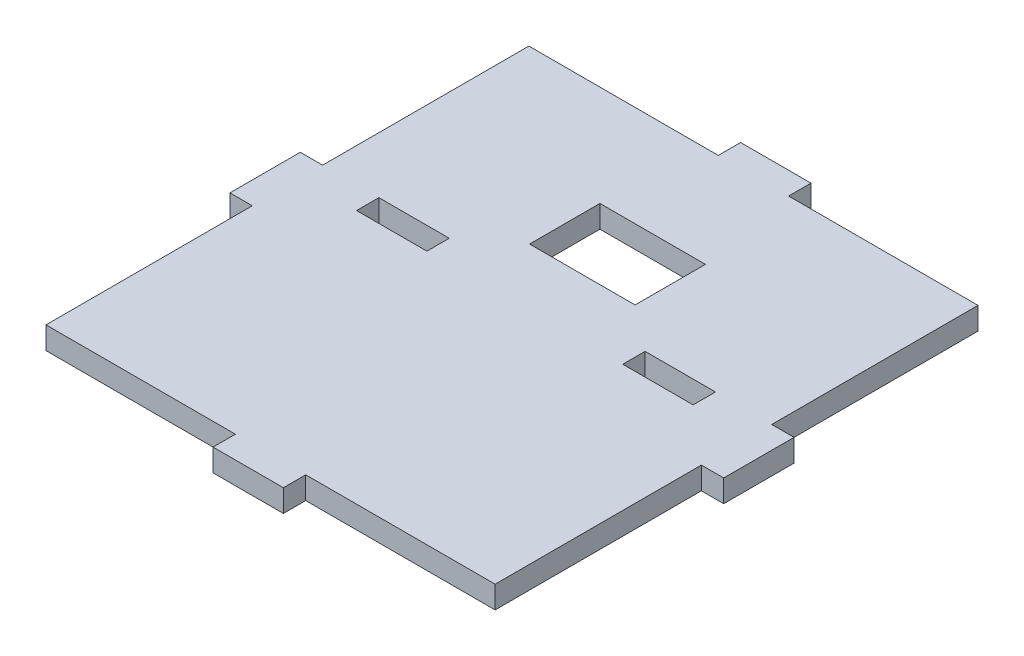
ISO-10303-21;
HEADER;
FILE_DESCRIPTION(('STEP AP214'),'2;1');
FILE_NAME('part.step','',(''),(''),'','','');
FILE_SCHEMA(('AUTOMOTIVE_DESIGN { 1 0 10303 214 1 1 1 1 }'));
ENDSEC;
DATA;
#1=APPLICATION_CONTEXT('core data for automotive mechanical design processes');
#2=APPLICATION_PROTOCOL_DEFINITION('international standard','automotive_design',2000,#1);
#3=PRODUCT_CONTEXT('',#1,'mechanical');
#4=PRODUCT('Part','Part','',(#3));
#5=PRODUCT_RELATED_PRODUCT_CATEGORY('part','',(#4));
#6=PRODUCT_DEFINITION_FORMATION('','',#4);
#7=PRODUCT_DEFINITION_CONTEXT('part definition',#1,'design');
#8=PRODUCT_DEFINITION('design','',#6,#7);
#9=PRODUCT_DEFINITION_SHAPE('','',#8);
#10=(LENGTH_UNIT() NAMED_UNIT(*) SI_UNIT(.MILLI.,.METRE.));
#11=(NAMED_UNIT(*) PLANE_ANGLE_UNIT() SI_UNIT($,.RADIAN.));
#12=(NAMED_UNIT(*) SI_UNIT($,.STERADIAN.) SOLID_ANGLE_UNIT());
#13=UNCERTAINTY_MEASURE_WITH_UNIT(LENGTH_MEASURE(1.E-05),#10,'distance_accuracy_value','');
#14=(GEOMETRIC_REPRESENTATION_CONTEXT(3) GLOBAL_UNCERTAINTY_ASSIGNED_CONTEXT((#13)) GLOBAL_UNIT_ASSIGNED_CONTEXT((#10,
#11,#12)) REPRESENTATION_CONTEXT('',''));
#15=CARTESIAN_POINT('',(0.,0.,0.));
#16=DIRECTION('',(0.,0.,1.));
#17=DIRECTION('',(1.,0.,0.));
#18=AXIS2_PLACEMENT_3D('',#15,#16,#17);
#19=CARTESIAN_POINT('',(140.4,12.7,0.));
#20=DIRECTION('',(1.,0.,0.));
#21=DIRECTION('',(0.,0.,-1.));
#22=AXIS2_PLACEMENT_3D('',#19,#20,#21);
#23=PLANE('',#22);
#24=DIRECTION('',(0.,0.,1.));
#25=VECTOR('',#24,1.);
#26=CARTESIAN_POINT('',(140.4,0.,0.));
#27=LINE('',#26,#25);
#28=CARTESIAN_POINT('',(140.4,0.,-20.));
#29=VERTEX_POINT('',#28);
#30=CARTESIAN_POINT('',(140.4,0.,20.));
#31=VERTEX_POINT('',#30);
#32=EDGE_CURVE('E387',#29,#31,#27,.T.);
#33=ORIENTED_EDGE('',*,*,#32,.F.);
#34=DIRECTION('',(0.,-1.,0.));
#35=VECTOR('',#34,1.);
#36=CARTESIAN_POINT('',(140.4,12.7,-20.));
#37=LINE('',#36,#35);
#38=CARTESIAN_POINT('',(140.4,12.7,-20.));
#39=VERTEX_POINT('',#38);
#40=EDGE_CURVE('E12',#39,#29,#37,.T.);
#41=ORIENTED_EDGE('',*,*,#40,.F.);
#42=DIRECTION('',(0.,0.,1.));
#43=VECTOR('',#42,1.);
#44=CARTESIAN_POINT('',(140.4,12.7,0.));
#45=LINE('',#44,#43);
#46=CARTESIAN_POINT('',(140.4,12.7,20.));
#47=VERTEX_POINT('',#46);
#48=EDGE_CURVE('E377',#39,#47,#45,.T.);
#49=ORIENTED_EDGE('',*,*,#48,.T.);
#50=DIRECTION('',(0.,-1.,0.));
#51=VECTOR('',#50,1.);
#52=CARTESIAN_POINT('',(140.4,12.7,20.));
#53=LINE('',#52,#51);
#54=EDGE_CURVE('E386',#47,#31,#53,.T.);
#55=ORIENTED_EDGE('',*,*,#54,.T.);
#56=EDGE_LOOP('',(#33,#41,#49,#55));
#57=FACE_BOUND('',#56,.T.);
#58=ADVANCED_FACE('F65',(#57),#23,.T.);
#59=CARTESIAN_POINT('',(0.,12.7,-20.));
#60=DIRECTION('',(0.,0.,-1.));
#61=DIRECTION('',(-1.,0.,0.));
#62=AXIS2_PLACEMENT_3D('',#59,#60,#61);
#63=PLANE('',#62);
#64=DIRECTION('',(1.,0.,0.));
#65=VECTOR('',#64,1.);
#66=CARTESIAN_POINT('',(0.,0.,-20.));
#67=LINE('',#66,#65);
#68=CARTESIAN_POINT('',(127.7,0.,-20.));
#69=VERTEX_POINT('',#68);
#70=EDGE_CURVE('E390',#69,#29,#67,.T.);
#71=ORIENTED_EDGE('',*,*,#70,.F.);
#72=DIRECTION('',(0.,-1.,0.));
#73=VECTOR('',#72,1.);
#74=CARTESIAN_POINT('',(127.7,12.7,-20.));
#75=LINE('',#74,#73);
#76=CARTESIAN_POINT('',(127.7,12.7,-20.));
#77=VERTEX_POINT('',#76);
#78=EDGE_CURVE('E74',#77,#69,#75,.T.);
#79=ORIENTED_EDGE('',*,*,#78,.F.);
#80=DIRECTION('',(1.,0.,0.));
#81=VECTOR('',#80,1.);
#82=CARTESIAN_POINT('',(0.,12.7,-20.));
#83=LINE('',#82,#81);
#84=EDGE_CURVE('E380',#77,#39,#83,.T.);
#85=ORIENTED_EDGE('',*,*,#84,.T.);
#86=ORIENTED_EDGE('',*,*,#40,.T.);
#87=EDGE_LOOP('',(#71,#79,#85,#86));
#88=FACE_BOUND('',#87,.T.);
#89=ADVANCED_FACE('F550',(#88),#63,.T.);
#90=CARTESIAN_POINT('',(0.,12.7,20.));
#91=DIRECTION('',(0.,0.,-1.));
#92=DIRECTION('',(-1.,0.,0.));
#93=AXIS2_PLACEMENT_3D('',#90,#91,#92);
#94=PLANE('',#93);
#95=DIRECTION('',(1.,0.,0.));
#96=VECTOR('',#95,1.);
#97=CARTESIAN_POINT('',(0.,0.,20.));
#98=LINE('',#97,#96);
#99=CARTESIAN_POINT('',(127.7,0.,20.));
#100=VERTEX_POINT('',#99);
#101=EDGE_CURVE('E381',#100,#31,#98,.T.);
#102=ORIENTED_EDGE('',*,*,#101,.T.);
#103=ORIENTED_EDGE('',*,*,#54,.F.);
#104=DIRECTION('',(1.,0.,0.));
#105=VECTOR('',#104,1.);
#106=CARTESIAN_POINT('',(0.,12.7,20.));
#107=LINE('',#106,#105);
#108=CARTESIAN_POINT('',(127.7,12.7,20.));
#109=VERTEX_POINT('',#108);
#110=EDGE_CURVE('E384',#109,#47,#107,.T.);
#111=ORIENTED_EDGE('',*,*,#110,.F.);
#112=DIRECTION('',(0.,-1.,0.));
#113=VECTOR('',#112,1.);
#114=CARTESIAN_POINT('',(127.7,12.7,20.));
#115=LINE('',#114,#113);
#116=EDGE_CURVE('E397',#109,#100,#115,.T.);
#117=ORIENTED_EDGE('',*,*,#116,.T.);
#118=EDGE_LOOP('',(#102,#103,#111,#117));
#119=FACE_BOUND('',#118,.T.);
#120=ADVANCED_FACE('F558',(#119),#94,.F.);
#121=CARTESIAN_POINT('',(0.,12.7,0.));
#122=DIRECTION('',(0.,1.,0.));
#123=DIRECTION('',(0.,0.,1.));
#124=AXIS2_PLACEMENT_3D('',#121,#122,#123);
#125=PLANE('',#124);
#126=DIRECTION('',(0.,0.,1.));
#127=VECTOR('',#126,1.);
#128=CARTESIAN_POINT('',(-95.7,12.7,-20.));
#129=LINE('',#128,#127);
#130=CARTESIAN_POINT('',(-95.7,12.7,-20.));
#131=VERTEX_POINT('',#130);
#132=CARTESIAN_POINT('',(-95.7,12.7,-7.29999999999999));
#133=VERTEX_POINT('',#132);
#134=EDGE_CURVE('E82',#131,#133,#129,.T.);
#135=ORIENTED_EDGE('',*,*,#134,.F.);
#136=DIRECTION('',(-1.,0.,0.));
#137=VECTOR('',#136,1.);
#138=CARTESIAN_POINT('',(-95.7,12.7,-20.));
#139=LINE('',#138,#137);
#140=CARTESIAN_POINT('',(-55.7,12.7,-20.));
#141=VERTEX_POINT('',#140);
#142=EDGE_CURVE('E296',#141,#131,#139,.T.);
#143=ORIENTED_EDGE('',*,*,#142,.F.);
#144=DIRECTION('',(0.,0.,-1.));
#145=VECTOR('',#144,1.);
#146=CARTESIAN_POINT('',(-55.7,12.7,-20.));
#147=LINE('',#146,#145);
#148=CARTESIAN_POINT('',(-55.7,12.7,-7.29999999999999));
#149=VERTEX_POINT('',#148);
#150=EDGE_CURVE('E299',#149,#141,#147,.T.);
#151=ORIENTED_EDGE('',*,*,#150,.F.);
#152=DIRECTION('',(1.,0.,0.));
#153=VECTOR('',#152,1.);
#154=CARTESIAN_POINT('',(-95.7,12.7,-7.29999999999999));
#155=LINE('',#154,#153);
#156=EDGE_CURVE('E305',#133,#149,#155,.T.);
#157=ORIENTED_EDGE('',*,*,#156,.F.);
#158=EDGE_LOOP('',(#135,#143,#151,#157));
#159=FACE_BOUND('',#158,.T.);
#160=DIRECTION('',(0.,0.,1.));
#161=VECTOR('',#160,1.);
#162=CARTESIAN_POINT('',(55.7,12.7,-20.));
#163=LINE('',#162,#161);
#164=CARTESIAN_POINT('',(55.7,12.7,-20.));
#165=VERTEX_POINT('',#164);
#166=CARTESIAN_POINT('',(55.7,12.7,-7.29999999999999));
#167=VERTEX_POINT('',#166);
#168=EDGE_CURVE('E90',#165,#167,#163,.T.);
#169=ORIENTED_EDGE('',*,*,#168,.F.);
#170=DIRECTION('',(-1.,0.,0.));
#171=VECTOR('',#170,1.);
#172=CARTESIAN_POINT('',(55.7,12.7,-20.));
#173=LINE('',#172,#171);
#174=CARTESIAN_POINT('',(95.7,12.7,-20.));
#175=VERTEX_POINT('',#174);
#176=EDGE_CURVE('E325',#175,#165,#173,.T.);
#177=ORIENTED_EDGE('',*,*,#176,.F.);
#178=DIRECTION('',(0.,0.,-1.));
#179=VECTOR('',#178,1.);
#180=CARTESIAN_POINT('',(95.7,12.7,-20.));
#181=LINE('',#180,#179);
#182=CARTESIAN_POINT('',(95.7,12.7,-7.29999999999999));
#183=VERTEX_POINT('',#182);
#184=EDGE_CURVE('E328',#183,#175,#181,.T.);
#185=ORIENTED_EDGE('',*,*,#184,.F.);
#186=DIRECTION('',(1.,0.,0.));
#187=VECTOR('',#186,1.);
#188=CARTESIAN_POINT('',(55.7,12.7,-7.29999999999999));
#189=LINE('',#188,#187);
#190=EDGE_CURVE('E332',#167,#183,#189,.T.);
#191=ORIENTED_EDGE('',*,*,#190,.F.);
#192=EDGE_LOOP('',(#169,#177,#185,#191));
#193=FACE_BOUND('',#192,.T.);
#194=DIRECTION('',(0.,0.,1.));
#195=VECTOR('',#194,1.);
#196=CARTESIAN_POINT('',(-30.,12.7,-40.));
#197=LINE('',#196,#195);
#198=CARTESIAN_POINT('',(-30.,12.7,-80.));
#199=VERTEX_POINT('',#198);
#200=CARTESIAN_POINT('',(-30.,12.7,-40.));
#201=VERTEX_POINT('',#200);
#202=EDGE_CURVE('E324',#199,#201,#197,.T.);
#203=ORIENTED_EDGE('',*,*,#202,.F.);
#204=DIRECTION('',(-1.,0.,0.));
#205=VECTOR('',#204,1.);
#206=CARTESIAN_POINT('',(-30.,12.7,-80.));
#207=LINE('',#206,#205);
#208=CARTESIAN_POINT('',(30.,12.7,-80.));
#209=VERTEX_POINT('',#208);
#210=EDGE_CURVE('E356',#209,#199,#207,.T.);
#211=ORIENTED_EDGE('',*,*,#210,.F.);
#212=DIRECTION('',(0.,0.,-1.));
#213=VECTOR('',#212,1.);
#214=CARTESIAN_POINT('',(30.,12.7,-40.));
#215=LINE('',#214,#213);
#216=CARTESIAN_POINT('',(30.,12.7,-40.));
#217=VERTEX_POINT('',#216);
#218=EDGE_CURVE('E359',#217,#209,#215,.T.);
#219=ORIENTED_EDGE('',*,*,#218,.F.);
#220=DIRECTION('',(1.,0.,0.));
#221=VECTOR('',#220,1.);
#222=CARTESIAN_POINT('',(-30.,12.7,-40.));
#223=LINE('',#222,#221);
#224=EDGE_CURVE('E363',#201,#217,#223,.T.);
#225=ORIENTED_EDGE('',*,*,#224,.F.);
#226=EDGE_LOOP('',(#203,#211,#219,#225));
#227=FACE_BOUND('',#226,.T.);
#228=ORIENTED_EDGE('',*,*,#48,.F.);
#229=ORIENTED_EDGE('',*,*,#84,.F.);
#230=DIRECTION('',(0.,0.,-1.));
#231=VECTOR('',#230,1.);
#232=CARTESIAN_POINT('',(127.7,12.7,137.3));
#233=LINE('',#232,#231);
#234=CARTESIAN_POINT('',(127.7,12.7,-137.3));
#235=VERTEX_POINT('',#234);
#236=EDGE_CURVE('E432',#77,#235,#233,.T.);
#237=ORIENTED_EDGE('',*,*,#236,.T.);
#238=DIRECTION('',(1.,0.,0.));
#239=VECTOR('',#238,1.);
#240=CARTESIAN_POINT('',(-127.7,12.7,-137.3));
#241=LINE('',#240,#239);
#242=CARTESIAN_POINT('',(20.,12.7,-137.3));
#243=VERTEX_POINT('',#242);
#244=EDGE_CURVE('E427',#243,#235,#241,.T.);
#245=ORIENTED_EDGE('',*,*,#244,.F.);
#246=DIRECTION('',(0.,0.,-1.));
#247=VECTOR('',#246,1.);
#248=CARTESIAN_POINT('',(20.,12.7,-137.3));
#249=LINE('',#248,#247);
#250=CARTESIAN_POINT('',(20.,12.7,-150.));
#251=VERTEX_POINT('',#250);
#252=EDGE_CURVE('E502',#243,#251,#249,.T.);
#253=ORIENTED_EDGE('',*,*,#252,.T.);
#254=DIRECTION('',(1.,0.,0.));
#255=VECTOR('',#254,1.);
#256=CARTESIAN_POINT('',(-20.,12.7,-150.));
#257=LINE('',#256,#255);
#258=CARTESIAN_POINT('',(-20.,12.7,-150.));
#259=VERTEX_POINT('',#258);
#260=EDGE_CURVE('E498',#259,#251,#257,.T.);
#261=ORIENTED_EDGE('',*,*,#260,.F.);
#262=DIRECTION('',(0.,0.,-1.));
#263=VECTOR('',#262,1.);
#264=CARTESIAN_POINT('',(-20.,12.7,-137.3));
#265=LINE('',#264,#263);
#266=CARTESIAN_POINT('',(-20.,12.7,-137.3));
#267=VERTEX_POINT('',#266);
#268=EDGE_CURVE('E495',#267,#259,#265,.T.);
#269=ORIENTED_EDGE('',*,*,#268,.F.);
#270=CARTESIAN_POINT('',(-127.7,12.7,-137.3));
#271=VERTEX_POINT('',#270);
#272=EDGE_CURVE('E429',#271,#267,#241,.T.);
#273=ORIENTED_EDGE('',*,*,#272,.F.);
#274=DIRECTION('',(0.,0.,-1.));
#275=VECTOR('',#274,1.);
#276=CARTESIAN_POINT('',(-127.7,12.7,137.3));
#277=LINE('',#276,#275);
#278=CARTESIAN_POINT('',(-127.7,12.7,-20.));
#279=VERTEX_POINT('',#278);
#280=EDGE_CURVE('E428',#279,#271,#277,.T.);
#281=ORIENTED_EDGE('',*,*,#280,.F.);
#282=DIRECTION('',(-1.,0.,0.));
#283=VECTOR('',#282,1.);
#284=CARTESIAN_POINT('',(-127.7,12.7,-20.));
#285=LINE('',#284,#283);
#286=CARTESIAN_POINT('',(-140.4,12.7,-20.));
#287=VERTEX_POINT('',#286);
#288=EDGE_CURVE('E468',#279,#287,#285,.T.);
#289=ORIENTED_EDGE('',*,*,#288,.T.);
#290=DIRECTION('',(0.,0.,1.));
#291=VECTOR('',#290,1.);
#292=CARTESIAN_POINT('',(-140.4,12.7,-20.));
#293=LINE('',#292,#291);
#294=CARTESIAN_POINT('',(-140.4,12.7,20.));
#295=VERTEX_POINT('',#294);
#296=EDGE_CURVE('E471',#287,#295,#293,.T.);
#297=ORIENTED_EDGE('',*,*,#296,.T.);
#298=DIRECTION('',(-1.,0.,0.));
#299=VECTOR('',#298,1.);
#300=CARTESIAN_POINT('',(-127.7,12.7,20.));
#301=LINE('',#300,#299);
#302=CARTESIAN_POINT('',(-127.7,12.7,20.));
#303=VERTEX_POINT('',#302);
#304=EDGE_CURVE('E474',#303,#295,#301,.T.);
#305=ORIENTED_EDGE('',*,*,#304,.F.);
#306=CARTESIAN_POINT('',(-127.7,12.7,137.3));
#307=VERTEX_POINT('',#306);
#308=EDGE_CURVE('E424',#307,#303,#277,.T.);
#309=ORIENTED_EDGE('',*,*,#308,.F.);
#310=DIRECTION('',(1.,0.,0.));
#311=VECTOR('',#310,1.);
#312=CARTESIAN_POINT('',(-127.7,12.7,137.3));
#313=LINE('',#312,#311);
#314=CARTESIAN_POINT('',(-20.,12.7,137.3));
#315=VERTEX_POINT('',#314);
#316=EDGE_CURVE('E437',#307,#315,#313,.T.);
#317=ORIENTED_EDGE('',*,*,#316,.T.);
#318=DIRECTION('',(0.,0.,1.));
#319=VECTOR('',#318,1.);
#320=CARTESIAN_POINT('',(-20.,12.7,0.));
#321=LINE('',#320,#319);
#322=CARTESIAN_POINT('',(-20.,12.7,150.));
#323=VERTEX_POINT('',#322);
#324=EDGE_CURVE('E400',#315,#323,#321,.T.);
#325=ORIENTED_EDGE('',*,*,#324,.T.);
#326=DIRECTION('',(1.,0.,0.));
#327=VECTOR('',#326,1.);
#328=CARTESIAN_POINT('',(-1.04083408558608E-13,12.7,150.));
#329=LINE('',#328,#327);
#330=CARTESIAN_POINT('',(20.,12.7,150.));
#331=VERTEX_POINT('',#330);
#332=EDGE_CURVE('E402',#323,#331,#329,.T.);
#333=ORIENTED_EDGE('',*,*,#332,.T.);
#334=DIRECTION('',(0.,0.,1.));
#335=VECTOR('',#334,1.);
#336=CARTESIAN_POINT('',(20.,12.7,0.));
#337=LINE('',#336,#335);
#338=CARTESIAN_POINT('',(20.,12.7,137.3));
#339=VERTEX_POINT('',#338);
#340=EDGE_CURVE('E405',#339,#331,#337,.T.);
#341=ORIENTED_EDGE('',*,*,#340,.F.);
#342=CARTESIAN_POINT('',(127.7,12.7,137.3));
#343=VERTEX_POINT('',#342);
#344=EDGE_CURVE('E436',#339,#343,#313,.T.);
#345=ORIENTED_EDGE('',*,*,#344,.T.);
#346=EDGE_CURVE('E433',#343,#109,#233,.T.);
#347=ORIENTED_EDGE('',*,*,#346,.T.);
#348=ORIENTED_EDGE('',*,*,#110,.T.);
#349=EDGE_LOOP('',(#228,#229,#237,#245,#253,#261,#269,#273,#281,#289,#297,#305,#309,#317,#325,
#333,#341,#345,#347,#348));
#350=FACE_BOUND('',#349,.T.);
#351=ADVANCED_FACE('F531',(#159,#193,#227,#350),#125,.T.);
#352=CARTESIAN_POINT('',(0.,0.,0.));
#353=DIRECTION('',(0.,1.,0.));
#354=DIRECTION('',(0.,0.,1.));
#355=AXIS2_PLACEMENT_3D('',#352,#353,#354);
#356=PLANE('',#355);
#357=DIRECTION('',(-1.,0.,0.));
#358=VECTOR('',#357,1.);
#359=CARTESIAN_POINT('',(-95.7,0.,-20.));
#360=LINE('',#359,#358);
#361=CARTESIAN_POINT('',(-55.7,0.,-20.));
#362=VERTEX_POINT('',#361);
#363=CARTESIAN_POINT('',(-95.7,0.,-20.));
#364=VERTEX_POINT('',#363);
#365=EDGE_CURVE('E283',#362,#364,#360,.T.);
#366=ORIENTED_EDGE('',*,*,#365,.T.);
#367=DIRECTION('',(0.,0.,1.));
#368=VECTOR('',#367,1.);
#369=CARTESIAN_POINT('',(-95.7,0.,-20.));
#370=LINE('',#369,#368);
#371=CARTESIAN_POINT('',(-95.7,0.,-7.29999999999999));
#372=VERTEX_POINT('',#371);
#373=EDGE_CURVE('E277',#364,#372,#370,.T.);
#374=ORIENTED_EDGE('',*,*,#373,.T.);
#375=DIRECTION('',(1.,0.,0.));
#376=VECTOR('',#375,1.);
#377=CARTESIAN_POINT('',(-95.7,0.,-7.29999999999999));
#378=LINE('',#377,#376);
#379=CARTESIAN_POINT('',(-55.7,0.,-7.29999999999999));
#380=VERTEX_POINT('',#379);
#381=EDGE_CURVE('E287',#372,#380,#378,.T.);
#382=ORIENTED_EDGE('',*,*,#381,.T.);
#383=DIRECTION('',(0.,0.,-1.));
#384=VECTOR('',#383,1.);
#385=CARTESIAN_POINT('',(-55.7,0.,-20.));
#386=LINE('',#385,#384);
#387=EDGE_CURVE('E291',#380,#362,#386,.T.);
#388=ORIENTED_EDGE('',*,*,#387,.T.);
#389=EDGE_LOOP('',(#366,#374,#382,#388));
#390=FACE_BOUND('',#389,.T.);
#391=DIRECTION('',(-1.,0.,0.));
#392=VECTOR('',#391,1.);
#393=CARTESIAN_POINT('',(55.7,0.,-20.));
#394=LINE('',#393,#392);
#395=CARTESIAN_POINT('',(95.7,0.,-20.));
#396=VERTEX_POINT('',#395);
#397=CARTESIAN_POINT('',(55.7,0.,-20.));
#398=VERTEX_POINT('',#397);
#399=EDGE_CURVE('E317',#396,#398,#394,.T.);
#400=ORIENTED_EDGE('',*,*,#399,.T.);
#401=DIRECTION('',(0.,0.,1.));
#402=VECTOR('',#401,1.);
#403=CARTESIAN_POINT('',(55.7,0.,-20.));
#404=LINE('',#403,#402);
#405=CARTESIAN_POINT('',(55.7,0.,-7.29999999999999));
#406=VERTEX_POINT('',#405);
#407=EDGE_CURVE('E329',#398,#406,#404,.T.);
#408=ORIENTED_EDGE('',*,*,#407,.T.);
#409=DIRECTION('',(1.,0.,0.));
#410=VECTOR('',#409,1.);
#411=CARTESIAN_POINT('',(55.7,0.,-7.29999999999999));
#412=LINE('',#411,#410);
#413=CARTESIAN_POINT('',(95.7,0.,-7.29999999999999));
#414=VERTEX_POINT('',#413);
#415=EDGE_CURVE('E341',#406,#414,#412,.T.);
#416=ORIENTED_EDGE('',*,*,#415,.T.);
#417=DIRECTION('',(0.,0.,-1.));
#418=VECTOR('',#417,1.);
#419=CARTESIAN_POINT('',(95.7,0.,-20.));
#420=LINE('',#419,#418);
#421=EDGE_CURVE('E338',#414,#396,#420,.T.);
#422=ORIENTED_EDGE('',*,*,#421,.T.);
#423=EDGE_LOOP('',(#400,#408,#416,#422));
#424=FACE_BOUND('',#423,.T.);
#425=DIRECTION('',(-1.,0.,0.));
#426=VECTOR('',#425,1.);
#427=CARTESIAN_POINT('',(-30.,0.,-80.));
#428=LINE('',#427,#426);
#429=CARTESIAN_POINT('',(30.,0.,-80.));
#430=VERTEX_POINT('',#429);
#431=CARTESIAN_POINT('',(-30.,0.,-80.));
#432=VERTEX_POINT('',#431);
#433=EDGE_CURVE('E349',#430,#432,#428,.T.);
#434=ORIENTED_EDGE('',*,*,#433,.T.);
#435=DIRECTION('',(0.,0.,1.));
#436=VECTOR('',#435,1.);
#437=CARTESIAN_POINT('',(-30.,0.,-40.));
#438=LINE('',#437,#436);
#439=CARTESIAN_POINT('',(-30.,0.,-40.));
#440=VERTEX_POINT('',#439);
#441=EDGE_CURVE('E360',#432,#440,#438,.T.);
#442=ORIENTED_EDGE('',*,*,#441,.T.);
#443=DIRECTION('',(1.,0.,0.));
#444=VECTOR('',#443,1.);
#445=CARTESIAN_POINT('',(-30.,0.,-40.));
#446=LINE('',#445,#444);
#447=CARTESIAN_POINT('',(30.,0.,-40.));
#448=VERTEX_POINT('',#447);
#449=EDGE_CURVE('E372',#440,#448,#446,.T.);
#450=ORIENTED_EDGE('',*,*,#449,.T.);
#451=DIRECTION('',(0.,0.,-1.));
#452=VECTOR('',#451,1.);
#453=CARTESIAN_POINT('',(30.,0.,-40.));
#454=LINE('',#453,#452);
#455=EDGE_CURVE('E369',#448,#430,#454,.T.);
#456=ORIENTED_EDGE('',*,*,#455,.T.);
#457=EDGE_LOOP('',(#434,#442,#450,#456));
#458=FACE_BOUND('',#457,.T.);
#459=ORIENTED_EDGE('',*,*,#32,.T.);
#460=ORIENTED_EDGE('',*,*,#101,.F.);
#461=DIRECTION('',(0.,0.,-1.));
#462=VECTOR('',#461,1.);
#463=CARTESIAN_POINT('',(127.7,0.,137.3));
#464=LINE('',#463,#462);
#465=CARTESIAN_POINT('',(127.7,0.,137.3));
#466=VERTEX_POINT('',#465);
#467=EDGE_CURVE('E450',#466,#100,#464,.T.);
#468=ORIENTED_EDGE('',*,*,#467,.F.);
#469=DIRECTION('',(1.,0.,0.));
#470=VECTOR('',#469,1.);
#471=CARTESIAN_POINT('',(-127.7,0.,137.3));
#472=LINE('',#471,#470);
#473=CARTESIAN_POINT('',(20.,0.,137.3));
#474=VERTEX_POINT('',#473);
#475=EDGE_CURVE('E453',#474,#466,#472,.T.);
#476=ORIENTED_EDGE('',*,*,#475,.F.);
#477=DIRECTION('',(0.,0.,1.));
#478=VECTOR('',#477,1.);
#479=CARTESIAN_POINT('',(20.,0.,0.));
#480=LINE('',#479,#478);
#481=CARTESIAN_POINT('',(20.,0.,150.));
#482=VERTEX_POINT('',#481);
#483=EDGE_CURVE('E403',#474,#482,#480,.T.);
#484=ORIENTED_EDGE('',*,*,#483,.T.);
#485=DIRECTION('',(1.,0.,0.));
#486=VECTOR('',#485,1.);
#487=CARTESIAN_POINT('',(-1.04083408558608E-13,0.,150.));
#488=LINE('',#487,#486);
#489=CARTESIAN_POINT('',(-20.,0.,150.));
#490=VERTEX_POINT('',#489);
#491=EDGE_CURVE('E411',#490,#482,#488,.T.);
#492=ORIENTED_EDGE('',*,*,#491,.F.);
#493=DIRECTION('',(0.,0.,1.));
#494=VECTOR('',#493,1.);
#495=CARTESIAN_POINT('',(-20.,0.,0.));
#496=LINE('',#495,#494);
#497=CARTESIAN_POINT('',(-20.,0.,137.3));
#498=VERTEX_POINT('',#497);
#499=EDGE_CURVE('E409',#498,#490,#496,.T.);
#500=ORIENTED_EDGE('',*,*,#499,.F.);
#501=CARTESIAN_POINT('',(-127.7,0.,137.3));
#502=VERTEX_POINT('',#501);
#503=EDGE_CURVE('E454',#502,#498,#472,.T.);
#504=ORIENTED_EDGE('',*,*,#503,.F.);
#505=DIRECTION('',(0.,0.,-1.));
#506=VECTOR('',#505,1.);
#507=CARTESIAN_POINT('',(-127.7,0.,137.3));
#508=LINE('',#507,#506);
#509=CARTESIAN_POINT('',(-127.7,0.,20.));
#510=VERTEX_POINT('',#509);
#511=EDGE_CURVE('E441',#502,#510,#508,.T.);
#512=ORIENTED_EDGE('',*,*,#511,.T.);
#513=DIRECTION('',(-1.,0.,0.));
#514=VECTOR('',#513,1.);
#515=CARTESIAN_POINT('',(-127.7,0.,20.));
#516=LINE('',#515,#514);
#517=CARTESIAN_POINT('',(-140.4,0.,20.));
#518=VERTEX_POINT('',#517);
#519=EDGE_CURVE('E472',#510,#518,#516,.T.);
#520=ORIENTED_EDGE('',*,*,#519,.T.);
#521=DIRECTION('',(0.,0.,1.));
#522=VECTOR('',#521,1.);
#523=CARTESIAN_POINT('',(-140.4,0.,-20.));
#524=LINE('',#523,#522);
#525=CARTESIAN_POINT('',(-140.4,0.,-20.));
#526=VERTEX_POINT('',#525);
#527=EDGE_CURVE('E481',#526,#518,#524,.T.);
#528=ORIENTED_EDGE('',*,*,#527,.F.);
#529=DIRECTION('',(-1.,0.,0.));
#530=VECTOR('',#529,1.);
#531=CARTESIAN_POINT('',(-127.7,0.,-20.));
#532=LINE('',#531,#530);
#533=CARTESIAN_POINT('',(-127.7,0.,-20.));
#534=VERTEX_POINT('',#533);
#535=EDGE_CURVE('E478',#534,#526,#532,.T.);
#536=ORIENTED_EDGE('',*,*,#535,.F.);
#537=CARTESIAN_POINT('',(-127.7,0.,-137.3));
#538=VERTEX_POINT('',#537);
#539=EDGE_CURVE('E445',#534,#538,#508,.T.);
#540=ORIENTED_EDGE('',*,*,#539,.T.);
#541=DIRECTION('',(1.,0.,0.));
#542=VECTOR('',#541,1.);
#543=CARTESIAN_POINT('',(-127.7,0.,-137.3));
#544=LINE('',#543,#542);
#545=CARTESIAN_POINT('',(-20.,0.,-137.3));
#546=VERTEX_POINT('',#545);
#547=EDGE_CURVE('E446',#538,#546,#544,.T.);
#548=ORIENTED_EDGE('',*,*,#547,.T.);
#549=DIRECTION('',(0.,0.,-1.));
#550=VECTOR('',#549,1.);
#551=CARTESIAN_POINT('',(-20.,0.,-137.3));
#552=LINE('',#551,#550);
#553=CARTESIAN_POINT('',(-20.,0.,-150.));
#554=VERTEX_POINT('',#553);
#555=EDGE_CURVE('E311',#546,#554,#552,.T.);
#556=ORIENTED_EDGE('',*,*,#555,.T.);
#557=DIRECTION('',(1.,0.,0.));
#558=VECTOR('',#557,1.);
#559=CARTESIAN_POINT('',(-20.,0.,-150.));
#560=LINE('',#559,#558);
#561=CARTESIAN_POINT('',(20.,0.,-150.));
#562=VERTEX_POINT('',#561);
#563=EDGE_CURVE('E506',#554,#562,#560,.T.);
#564=ORIENTED_EDGE('',*,*,#563,.T.);
#565=DIRECTION('',(0.,0.,-1.));
#566=VECTOR('',#565,1.);
#567=CARTESIAN_POINT('',(20.,0.,-137.3));
#568=LINE('',#567,#566);
#569=CARTESIAN_POINT('',(20.,0.,-137.3));
#570=VERTEX_POINT('',#569);
#571=EDGE_CURVE('E499',#570,#562,#568,.T.);
#572=ORIENTED_EDGE('',*,*,#571,.F.);
#573=CARTESIAN_POINT('',(127.7,0.,-137.3));
#574=VERTEX_POINT('',#573);
#575=EDGE_CURVE('E444',#570,#574,#544,.T.);
#576=ORIENTED_EDGE('',*,*,#575,.T.);
#577=EDGE_CURVE('E449',#69,#574,#464,.T.);
#578=ORIENTED_EDGE('',*,*,#577,.F.);
#579=ORIENTED_EDGE('',*,*,#70,.T.);
#580=EDGE_LOOP('',(#459,#460,#468,#476,#484,#492,#500,#504,#512,#520,#528,#536,#540,#548,#556,
#564,#572,#576,#578,#579));
#581=FACE_BOUND('',#580,.T.);
#582=ADVANCED_FACE('F293',(#390,#424,#458,#581),#356,.F.);
#583=CARTESIAN_POINT('',(-140.4,12.7,-20.));
#584=DIRECTION('',(1.,0.,0.));
#585=DIRECTION('',(0.,0.,-1.));
#586=AXIS2_PLACEMENT_3D('',#583,#584,#585);
#587=PLANE('',#586);
#588=ORIENTED_EDGE('',*,*,#527,.T.);
#589=DIRECTION('',(0.,-1.,0.));
#590=VECTOR('',#589,1.);
#591=CARTESIAN_POINT('',(-140.4,12.7,20.));
#592=LINE('',#591,#590);
#593=EDGE_CURVE('E477',#295,#518,#592,.T.);
#594=ORIENTED_EDGE('',*,*,#593,.F.);
#595=ORIENTED_EDGE('',*,*,#296,.F.);
#596=DIRECTION('',(0.,-1.,0.));
#597=VECTOR('',#596,1.);
#598=CARTESIAN_POINT('',(-140.4,12.7,-20.));
#599=LINE('',#598,#597);
#600=EDGE_CURVE('E492',#287,#526,#599,.T.);
#601=ORIENTED_EDGE('',*,*,#600,.T.);
#602=EDGE_LOOP('',(#588,#594,#595,#601));
#603=FACE_BOUND('',#602,.T.);
#604=ADVANCED_FACE('F595',(#603),#587,.F.);
#605=CARTESIAN_POINT('',(-127.7,12.7,-20.));
#606=DIRECTION('',(0.,0.,1.));
#607=DIRECTION('',(1.,0.,0.));
#608=AXIS2_PLACEMENT_3D('',#605,#606,#607);
#609=PLANE('',#608);
#610=ORIENTED_EDGE('',*,*,#535,.T.);
#611=ORIENTED_EDGE('',*,*,#600,.F.);
#612=ORIENTED_EDGE('',*,*,#288,.F.);
#613=DIRECTION('',(0.,-1.,0.));
#614=VECTOR('',#613,1.);
#615=CARTESIAN_POINT('',(-127.7,12.7,-20.));
#616=LINE('',#615,#614);
#617=EDGE_CURVE('E412',#279,#534,#616,.T.);
#618=ORIENTED_EDGE('',*,*,#617,.T.);
#619=EDGE_LOOP('',(#610,#611,#612,#618));
#620=FACE_BOUND('',#619,.T.);
#621=ADVANCED_FACE('F599',(#620),#609,.F.);
#622=CARTESIAN_POINT('',(-20.,12.7,-150.));
#623=DIRECTION('',(0.,0.,-1.));
#624=DIRECTION('',(-1.,0.,0.));
#625=AXIS2_PLACEMENT_3D('',#622,#623,#624);
#626=PLANE('',#625);
#627=ORIENTED_EDGE('',*,*,#563,.F.);
#628=DIRECTION('',(0.,-1.,0.));
#629=VECTOR('',#628,1.);
#630=CARTESIAN_POINT('',(-20.,12.7,-150.));
#631=LINE('',#630,#629);
#632=EDGE_CURVE('E69',#259,#554,#631,.T.);
#633=ORIENTED_EDGE('',*,*,#632,.F.);
#634=ORIENTED_EDGE('',*,*,#260,.T.);
#635=DIRECTION('',(0.,-1.,0.));
#636=VECTOR('',#635,1.);
#637=CARTESIAN_POINT('',(20.,12.7,-150.));
#638=LINE('',#637,#636);
#639=EDGE_CURVE('E482',#251,#562,#638,.T.);
#640=ORIENTED_EDGE('',*,*,#639,.T.);
#641=EDGE_LOOP('',(#627,#633,#634,#640));
#642=FACE_BOUND('',#641,.T.);
#643=ADVANCED_FACE('F519',(#642),#626,.T.);
#644=CARTESIAN_POINT('',(-20.,12.7,-137.3));
#645=DIRECTION('',(-1.,0.,0.));
#646=DIRECTION('',(0.,0.,1.));
#647=AXIS2_PLACEMENT_3D('',#644,#645,#646);
#648=PLANE('',#647);
#649=ORIENTED_EDGE('',*,*,#555,.F.);
#650=DIRECTION('',(0.,-1.,0.));
#651=VECTOR('',#650,1.);
#652=CARTESIAN_POINT('',(-20.,12.7,-137.3));
#653=LINE('',#652,#651);
#654=EDGE_CURVE('E459',#267,#546,#653,.T.);
#655=ORIENTED_EDGE('',*,*,#654,.F.);
#656=ORIENTED_EDGE('',*,*,#268,.T.);
#657=ORIENTED_EDGE('',*,*,#632,.T.);
#658=EDGE_LOOP('',(#649,#655,#656,#657));
#659=FACE_BOUND('',#658,.T.);
#660=ADVANCED_FACE('F67',(#659),#648,.T.);
#661=CARTESIAN_POINT('',(-1.04083408558608E-13,12.7,150.));
#662=DIRECTION('',(0.,0.,-1.));
#663=DIRECTION('',(-1.,0.,0.));
#664=AXIS2_PLACEMENT_3D('',#661,#662,#663);
#665=PLANE('',#664);
#666=ORIENTED_EDGE('',*,*,#491,.T.);
#667=DIRECTION('',(0.,-1.,0.));
#668=VECTOR('',#667,1.);
#669=CARTESIAN_POINT('',(20.,12.7,150.));
#670=LINE('',#669,#668);
#671=EDGE_CURVE('E418',#331,#482,#670,.T.);
#672=ORIENTED_EDGE('',*,*,#671,.F.);
#673=ORIENTED_EDGE('',*,*,#332,.F.);
#674=DIRECTION('',(0.,-1.,0.));
#675=VECTOR('',#674,1.);
#676=CARTESIAN_POINT('',(-20.,12.7,150.));
#677=LINE('',#676,#675);
#678=EDGE_CURVE('E420',#323,#490,#677,.T.);
#679=ORIENTED_EDGE('',*,*,#678,.T.);
#680=EDGE_LOOP('',(#666,#672,#673,#679));
#681=FACE_BOUND('',#680,.T.);
#682=ADVANCED_FACE('F575',(#681),#665,.F.);
#683=CARTESIAN_POINT('',(-20.,12.7,0.));
#684=DIRECTION('',(1.,0.,0.));
#685=DIRECTION('',(0.,0.,-1.));
#686=AXIS2_PLACEMENT_3D('',#683,#684,#685);
#687=PLANE('',#686);
#688=ORIENTED_EDGE('',*,*,#499,.T.);
#689=ORIENTED_EDGE('',*,*,#678,.F.);
#690=ORIENTED_EDGE('',*,*,#324,.F.);
#691=DIRECTION('',(0.,-1.,0.));
#692=VECTOR('',#691,1.);
#693=CARTESIAN_POINT('',(-20.,12.7,137.3));
#694=LINE('',#693,#692);
#695=EDGE_CURVE('E391',#315,#498,#694,.T.);
#696=ORIENTED_EDGE('',*,*,#695,.T.);
#697=EDGE_LOOP('',(#688,#689,#690,#696));
#698=FACE_BOUND('',#697,.T.);
#699=ADVANCED_FACE('F581',(#698),#687,.F.);
#700=CARTESIAN_POINT('',(-127.7,12.7,20.));
#701=DIRECTION('',(0.,0.,1.));
#702=DIRECTION('',(1.,0.,0.));
#703=AXIS2_PLACEMENT_3D('',#700,#701,#702);
#704=PLANE('',#703);
#705=ORIENTED_EDGE('',*,*,#519,.F.);
#706=DIRECTION('',(0.,-1.,0.));
#707=VECTOR('',#706,1.);
#708=CARTESIAN_POINT('',(-127.7,12.7,20.));
#709=LINE('',#708,#707);
#710=EDGE_CURVE('E488',#303,#510,#709,.T.);
#711=ORIENTED_EDGE('',*,*,#710,.F.);
#712=ORIENTED_EDGE('',*,*,#304,.T.);
#713=ORIENTED_EDGE('',*,*,#593,.T.);
#714=EDGE_LOOP('',(#705,#711,#712,#713));
#715=FACE_BOUND('',#714,.T.);
#716=ADVANCED_FACE('F591',(#715),#704,.T.);
#717=CARTESIAN_POINT('',(20.,12.7,0.));
#718=DIRECTION('',(1.,0.,0.));
#719=DIRECTION('',(0.,0.,-1.));
#720=AXIS2_PLACEMENT_3D('',#717,#718,#719);
#721=PLANE('',#720);
#722=ORIENTED_EDGE('',*,*,#483,.F.);
#723=DIRECTION('',(0.,-1.,0.));
#724=VECTOR('',#723,1.);
#725=CARTESIAN_POINT('',(20.,12.7,137.3));
#726=LINE('',#725,#724);
#727=EDGE_CURVE('E408',#339,#474,#726,.T.);
#728=ORIENTED_EDGE('',*,*,#727,.F.);
#729=ORIENTED_EDGE('',*,*,#340,.T.);
#730=ORIENTED_EDGE('',*,*,#671,.T.);
#731=EDGE_LOOP('',(#722,#728,#729,#730));
#732=FACE_BOUND('',#731,.T.);
#733=ADVANCED_FACE('F571',(#732),#721,.T.);
#734=CARTESIAN_POINT('',(20.,12.7,-137.3));
#735=DIRECTION('',(-1.,0.,0.));
#736=DIRECTION('',(0.,0.,1.));
#737=AXIS2_PLACEMENT_3D('',#734,#735,#736);
#738=PLANE('',#737);
#739=ORIENTED_EDGE('',*,*,#571,.T.);
#740=ORIENTED_EDGE('',*,*,#639,.F.);
#741=ORIENTED_EDGE('',*,*,#252,.F.);
#742=DIRECTION('',(0.,-1.,0.));
#743=VECTOR('',#742,1.);
#744=CARTESIAN_POINT('',(20.,12.7,-137.3));
#745=LINE('',#744,#743);
#746=EDGE_CURVE('E490',#243,#570,#745,.T.);
#747=ORIENTED_EDGE('',*,*,#746,.T.);
#748=EDGE_LOOP('',(#739,#740,#741,#747));
#749=FACE_BOUND('',#748,.T.);
#750=ADVANCED_FACE('F537',(#749),#738,.F.);
#751=CARTESIAN_POINT('',(-127.7,12.7,137.3));
#752=DIRECTION('',(-1.,0.,0.));
#753=DIRECTION('',(0.,0.,1.));
#754=AXIS2_PLACEMENT_3D('',#751,#752,#753);
#755=PLANE('',#754);
#756=ORIENTED_EDGE('',*,*,#617,.F.);
#757=ORIENTED_EDGE('',*,*,#280,.T.);
#758=DIRECTION('',(0.,-1.,0.));
#759=VECTOR('',#758,1.);
#760=CARTESIAN_POINT('',(-127.7,12.7,-137.3));
#761=LINE('',#760,#759);
#762=EDGE_CURVE('E440',#271,#538,#761,.T.);
#763=ORIENTED_EDGE('',*,*,#762,.T.);
#764=ORIENTED_EDGE('',*,*,#539,.F.);
#765=EDGE_LOOP('',(#756,#757,#763,#764));
#766=FACE_BOUND('',#765,.T.);
#767=ADVANCED_FACE('F601',(#766),#755,.T.);
#768=CARTESIAN_POINT('',(-127.7,12.7,-137.3));
#769=DIRECTION('',(0.,0.,-1.));
#770=DIRECTION('',(-1.,0.,0.));
#771=AXIS2_PLACEMENT_3D('',#768,#769,#770);
#772=PLANE('',#771);
#773=ORIENTED_EDGE('',*,*,#272,.T.);
#774=ORIENTED_EDGE('',*,*,#654,.T.);
#775=ORIENTED_EDGE('',*,*,#547,.F.);
#776=ORIENTED_EDGE('',*,*,#762,.F.);
#777=EDGE_LOOP('',(#773,#774,#775,#776));
#778=FACE_BOUND('',#777,.T.);
#779=ADVANCED_FACE('F527',(#778),#772,.T.);
#780=CARTESIAN_POINT('',(-127.7,12.7,137.3));
#781=DIRECTION('',(0.,0.,-1.));
#782=DIRECTION('',(-1.,0.,0.));
#783=AXIS2_PLACEMENT_3D('',#780,#781,#782);
#784=PLANE('',#783);
#785=ORIENTED_EDGE('',*,*,#695,.F.);
#786=ORIENTED_EDGE('',*,*,#316,.F.);
#787=DIRECTION('',(0.,-1.,0.));
#788=VECTOR('',#787,1.);
#789=CARTESIAN_POINT('',(-127.7,12.7,137.3));
#790=LINE('',#789,#788);
#791=EDGE_CURVE('E457',#307,#502,#790,.T.);
#792=ORIENTED_EDGE('',*,*,#791,.T.);
#793=ORIENTED_EDGE('',*,*,#503,.T.);
#794=EDGE_LOOP('',(#785,#786,#792,#793));
#795=FACE_BOUND('',#794,.T.);
#796=ADVANCED_FACE('F585',(#795),#784,.F.);
#797=ORIENTED_EDGE('',*,*,#308,.T.);
#798=ORIENTED_EDGE('',*,*,#710,.T.);
#799=ORIENTED_EDGE('',*,*,#511,.F.);
#800=ORIENTED_EDGE('',*,*,#791,.F.);
#801=EDGE_LOOP('',(#797,#798,#799,#800));
#802=FACE_BOUND('',#801,.T.);
#803=ADVANCED_FACE('F588',(#802),#755,.T.);
#804=ORIENTED_EDGE('',*,*,#344,.F.);
#805=ORIENTED_EDGE('',*,*,#727,.T.);
#806=ORIENTED_EDGE('',*,*,#475,.T.);
#807=DIRECTION('',(0.,-1.,0.));
#808=VECTOR('',#807,1.);
#809=CARTESIAN_POINT('',(127.7,12.7,137.3));
#810=LINE('',#809,#808);
#811=EDGE_CURVE('E460',#343,#466,#810,.T.);
#812=ORIENTED_EDGE('',*,*,#811,.F.);
#813=EDGE_LOOP('',(#804,#805,#806,#812));
#814=FACE_BOUND('',#813,.T.);
#815=ADVANCED_FACE('F566',(#814),#784,.F.);
#816=ORIENTED_EDGE('',*,*,#746,.F.);
#817=ORIENTED_EDGE('',*,*,#244,.T.);
#818=DIRECTION('',(0.,-1.,0.));
#819=VECTOR('',#818,1.);
#820=CARTESIAN_POINT('',(127.7,12.7,-137.3));
#821=LINE('',#820,#819);
#822=EDGE_CURVE('E463',#235,#574,#821,.T.);
#823=ORIENTED_EDGE('',*,*,#822,.T.);
#824=ORIENTED_EDGE('',*,*,#575,.F.);
#825=EDGE_LOOP('',(#816,#817,#823,#824));
#826=FACE_BOUND('',#825,.T.);
#827=ADVANCED_FACE('F542',(#826),#772,.T.);
#828=CARTESIAN_POINT('',(127.7,12.7,137.3));
#829=DIRECTION('',(-1.,0.,0.));
#830=DIRECTION('',(0.,0.,1.));
#831=AXIS2_PLACEMENT_3D('',#828,#829,#830);
#832=PLANE('',#831);
#833=ORIENTED_EDGE('',*,*,#236,.F.);
#834=ORIENTED_EDGE('',*,*,#78,.T.);
#835=ORIENTED_EDGE('',*,*,#577,.T.);
#836=ORIENTED_EDGE('',*,*,#822,.F.);
#837=EDGE_LOOP('',(#833,#834,#835,#836));
#838=FACE_BOUND('',#837,.T.);
#839=ADVANCED_FACE('F546',(#838),#832,.F.);
#840=ORIENTED_EDGE('',*,*,#116,.F.);
#841=ORIENTED_EDGE('',*,*,#346,.F.);
#842=ORIENTED_EDGE('',*,*,#811,.T.);
#843=ORIENTED_EDGE('',*,*,#467,.T.);
#844=EDGE_LOOP('',(#840,#841,#842,#843));
#845=FACE_BOUND('',#844,.T.);
#846=ADVANCED_FACE('F562',(#845),#832,.F.);
#847=CARTESIAN_POINT('',(-30.,0.,-40.));
#848=DIRECTION('',(-1.,0.,0.));
#849=DIRECTION('',(0.,0.,1.));
#850=AXIS2_PLACEMENT_3D('',#847,#848,#849);
#851=PLANE('',#850);
#852=ORIENTED_EDGE('',*,*,#202,.T.);
#853=DIRECTION('',(0.,1.,0.));
#854=VECTOR('',#853,1.);
#855=CARTESIAN_POINT('',(-30.,0.,-40.));
#856=LINE('',#855,#854);
#857=EDGE_CURVE('E346',#440,#201,#856,.T.);
#858=ORIENTED_EDGE('',*,*,#857,.F.);
#859=ORIENTED_EDGE('',*,*,#441,.F.);
#860=DIRECTION('',(0.,1.,0.));
#861=VECTOR('',#860,1.);
#862=CARTESIAN_POINT('',(-30.,0.,-80.));
#863=LINE('',#862,#861);
#864=EDGE_CURVE('E354',#432,#199,#863,.T.);
#865=ORIENTED_EDGE('',*,*,#864,.T.);
#866=EDGE_LOOP('',(#852,#858,#859,#865));
#867=FACE_BOUND('',#866,.T.);
#868=ADVANCED_FACE('F613',(#867),#851,.F.);
#869=CARTESIAN_POINT('',(-30.,0.,-80.));
#870=DIRECTION('',(0.,0.,-1.));
#871=DIRECTION('',(-1.,0.,0.));
#872=AXIS2_PLACEMENT_3D('',#869,#870,#871);
#873=PLANE('',#872);
#874=ORIENTED_EDGE('',*,*,#210,.T.);
#875=ORIENTED_EDGE('',*,*,#864,.F.);
#876=ORIENTED_EDGE('',*,*,#433,.F.);
#877=DIRECTION('',(0.,1.,0.));
#878=VECTOR('',#877,1.);
#879=CARTESIAN_POINT('',(30.,0.,-80.));
#880=LINE('',#879,#878);
#881=EDGE_CURVE('E352',#430,#209,#880,.T.);
#882=ORIENTED_EDGE('',*,*,#881,.T.);
#883=EDGE_LOOP('',(#874,#875,#876,#882));
#884=FACE_BOUND('',#883,.T.);
#885=ADVANCED_FACE('F665',(#884),#873,.F.);
#886=CARTESIAN_POINT('',(30.,0.,-40.));
#887=DIRECTION('',(1.,0.,0.));
#888=DIRECTION('',(0.,0.,-1.));
#889=AXIS2_PLACEMENT_3D('',#886,#887,#888);
#890=PLANE('',#889);
#891=ORIENTED_EDGE('',*,*,#218,.T.);
#892=ORIENTED_EDGE('',*,*,#881,.F.);
#893=ORIENTED_EDGE('',*,*,#455,.F.);
#894=DIRECTION('',(0.,1.,0.));
#895=VECTOR('',#894,1.);
#896=CARTESIAN_POINT('',(30.,0.,-40.));
#897=LINE('',#896,#895);
#898=EDGE_CURVE('E350',#448,#217,#897,.T.);
#899=ORIENTED_EDGE('',*,*,#898,.T.);
#900=EDGE_LOOP('',(#891,#892,#893,#899));
#901=FACE_BOUND('',#900,.T.);
#902=ADVANCED_FACE('F676',(#901),#890,.F.);
#903=CARTESIAN_POINT('',(-30.,0.,-40.));
#904=DIRECTION('',(0.,0.,1.));
#905=DIRECTION('',(1.,0.,0.));
#906=AXIS2_PLACEMENT_3D('',#903,#904,#905);
#907=PLANE('',#906);
#908=ORIENTED_EDGE('',*,*,#224,.T.);
#909=ORIENTED_EDGE('',*,*,#898,.F.);
#910=ORIENTED_EDGE('',*,*,#449,.F.);
#911=ORIENTED_EDGE('',*,*,#857,.T.);
#912=EDGE_LOOP('',(#908,#909,#910,#911));
#913=FACE_BOUND('',#912,.T.);
#914=ADVANCED_FACE('F686',(#913),#907,.F.);
#915=CARTESIAN_POINT('',(55.7,0.,-20.));
#916=DIRECTION('',(-1.,0.,0.));
#917=DIRECTION('',(0.,0.,1.));
#918=AXIS2_PLACEMENT_3D('',#915,#916,#917);
#919=PLANE('',#918);
#920=ORIENTED_EDGE('',*,*,#168,.T.);
#921=DIRECTION('',(0.,1.,0.));
#922=VECTOR('',#921,1.);
#923=CARTESIAN_POINT('',(55.7,0.,-7.29999999999999));
#924=LINE('',#923,#922);
#925=EDGE_CURVE('E315',#406,#167,#924,.T.);
#926=ORIENTED_EDGE('',*,*,#925,.F.);
#927=ORIENTED_EDGE('',*,*,#407,.F.);
#928=DIRECTION('',(0.,1.,0.));
#929=VECTOR('',#928,1.);
#930=CARTESIAN_POINT('',(55.7,0.,-20.));
#931=LINE('',#930,#929);
#932=EDGE_CURVE('E322',#398,#165,#931,.T.);
#933=ORIENTED_EDGE('',*,*,#932,.T.);
#934=EDGE_LOOP('',(#920,#926,#927,#933));
#935=FACE_BOUND('',#934,.T.);
#936=ADVANCED_FACE('F696',(#935),#919,.F.);
#937=CARTESIAN_POINT('',(55.7,0.,-20.));
#938=DIRECTION('',(0.,0.,-1.));
#939=DIRECTION('',(-1.,0.,0.));
#940=AXIS2_PLACEMENT_3D('',#937,#938,#939);
#941=PLANE('',#940);
#942=ORIENTED_EDGE('',*,*,#176,.T.);
#943=ORIENTED_EDGE('',*,*,#932,.F.);
#944=ORIENTED_EDGE('',*,*,#399,.F.);
#945=DIRECTION('',(0.,1.,0.));
#946=VECTOR('',#945,1.);
#947=CARTESIAN_POINT('',(95.7,0.,-20.));
#948=LINE('',#947,#946);
#949=EDGE_CURVE('E320',#396,#175,#948,.T.);
#950=ORIENTED_EDGE('',*,*,#949,.T.);
#951=EDGE_LOOP('',(#942,#943,#944,#950));
#952=FACE_BOUND('',#951,.T.);
#953=ADVANCED_FACE('F706',(#952),#941,.F.);
#954=CARTESIAN_POINT('',(95.7,0.,-20.));
#955=DIRECTION('',(1.,0.,0.));
#956=DIRECTION('',(0.,0.,-1.));
#957=AXIS2_PLACEMENT_3D('',#954,#955,#956);
#958=PLANE('',#957);
#959=ORIENTED_EDGE('',*,*,#184,.T.);
#960=ORIENTED_EDGE('',*,*,#949,.F.);
#961=ORIENTED_EDGE('',*,*,#421,.F.);
#962=DIRECTION('',(0.,1.,0.));
#963=VECTOR('',#962,1.);
#964=CARTESIAN_POINT('',(95.7,0.,-7.29999999999999));
#965=LINE('',#964,#963);
#966=EDGE_CURVE('E318',#414,#183,#965,.T.);
#967=ORIENTED_EDGE('',*,*,#966,.T.);
#968=EDGE_LOOP('',(#959,#960,#961,#967));
#969=FACE_BOUND('',#968,.T.);
#970=ADVANCED_FACE('F715',(#969),#958,.F.);
#971=CARTESIAN_POINT('',(55.7,0.,-7.29999999999999));
#972=DIRECTION('',(0.,0.,1.));
#973=DIRECTION('',(1.,0.,0.));
#974=AXIS2_PLACEMENT_3D('',#971,#972,#973);
#975=PLANE('',#974);
#976=ORIENTED_EDGE('',*,*,#190,.T.);
#977=ORIENTED_EDGE('',*,*,#966,.F.);
#978=ORIENTED_EDGE('',*,*,#415,.F.);
#979=ORIENTED_EDGE('',*,*,#925,.T.);
#980=EDGE_LOOP('',(#976,#977,#978,#979));
#981=FACE_BOUND('',#980,.T.);
#982=ADVANCED_FACE('F725',(#981),#975,.F.);
#983=CARTESIAN_POINT('',(-95.7,0.,-20.));
#984=DIRECTION('',(-1.,0.,0.));
#985=DIRECTION('',(0.,0.,1.));
#986=AXIS2_PLACEMENT_3D('',#983,#984,#985);
#987=PLANE('',#986);
#988=ORIENTED_EDGE('',*,*,#134,.T.);
#989=DIRECTION('',(0.,1.,0.));
#990=VECTOR('',#989,1.);
#991=CARTESIAN_POINT('',(-95.7,0.,-7.29999999999999));
#992=LINE('',#991,#990);
#993=EDGE_CURVE('E273',#372,#133,#992,.T.);
#994=ORIENTED_EDGE('',*,*,#993,.F.);
#995=ORIENTED_EDGE('',*,*,#373,.F.);
#996=DIRECTION('',(0.,1.,0.));
#997=VECTOR('',#996,1.);
#998=CARTESIAN_POINT('',(-95.7,0.,-20.));
#999=LINE('',#998,#997);
#1000=EDGE_CURVE('E309',#364,#131,#999,.T.);
#1001=ORIENTED_EDGE('',*,*,#1000,.T.);
#1002=EDGE_LOOP('',(#988,#994,#995,#1001));
#1003=FACE_BOUND('',#1002,.T.);
#1004=ADVANCED_FACE('F275',(#1003),#987,.F.);
#1005=CARTESIAN_POINT('',(-95.7,0.,-20.));
#1006=DIRECTION('',(0.,0.,-1.));
#1007=DIRECTION('',(-1.,0.,0.));
#1008=AXIS2_PLACEMENT_3D('',#1005,#1006,#1007);
#1009=PLANE('',#1008);
#1010=ORIENTED_EDGE('',*,*,#142,.T.);
#1011=ORIENTED_EDGE('',*,*,#1000,.F.);
#1012=ORIENTED_EDGE('',*,*,#365,.F.);
#1013=DIRECTION('',(0.,1.,0.));
#1014=VECTOR('',#1013,1.);
#1015=CARTESIAN_POINT('',(-55.7,0.,-20.));
#1016=LINE('',#1015,#1014);
#1017=EDGE_CURVE('E312',#362,#141,#1016,.T.);
#1018=ORIENTED_EDGE('',*,*,#1017,.T.);
#1019=EDGE_LOOP('',(#1010,#1011,#1012,#1018));
#1020=FACE_BOUND('',#1019,.T.);
#1021=ADVANCED_FACE('F744',(#1020),#1009,.F.);
#1022=CARTESIAN_POINT('',(-55.7,0.,-20.));
#1023=DIRECTION('',(1.,0.,0.));
#1024=DIRECTION('',(0.,0.,-1.));
#1025=AXIS2_PLACEMENT_3D('',#1022,#1023,#1024);
#1026=PLANE('',#1025);
#1027=ORIENTED_EDGE('',*,*,#150,.T.);
#1028=ORIENTED_EDGE('',*,*,#1017,.F.);
#1029=ORIENTED_EDGE('',*,*,#387,.F.);
#1030=DIRECTION('',(0.,1.,0.));
#1031=VECTOR('',#1030,1.);
#1032=CARTESIAN_POINT('',(-55.7,0.,-7.29999999999999));
#1033=LINE('',#1032,#1031);
#1034=EDGE_CURVE('E282',#380,#149,#1033,.T.);
#1035=ORIENTED_EDGE('',*,*,#1034,.T.);
#1036=EDGE_LOOP('',(#1027,#1028,#1029,#1035));
#1037=FACE_BOUND('',#1036,.T.);
#1038=ADVANCED_FACE('F753',(#1037),#1026,.F.);
#1039=CARTESIAN_POINT('',(-95.7,0.,-7.29999999999999));
#1040=DIRECTION('',(0.,0.,1.));
#1041=DIRECTION('',(1.,0.,0.));
#1042=AXIS2_PLACEMENT_3D('',#1039,#1040,#1041);
#1043=PLANE('',#1042);
#1044=ORIENTED_EDGE('',*,*,#156,.T.);
#1045=ORIENTED_EDGE('',*,*,#1034,.F.);
#1046=ORIENTED_EDGE('',*,*,#381,.F.);
#1047=ORIENTED_EDGE('',*,*,#993,.T.);
#1048=EDGE_LOOP('',(#1044,#1045,#1046,#1047));
#1049=FACE_BOUND('',#1048,.T.);
#1050=ADVANCED_FACE('F288',(#1049),#1043,.F.);
#1051=CLOSED_SHELL('',(#58,#89,#120,#351,#582,#604,#621,#643,#660,#682,#699,#716,#733,#750,#767,
#779,#796,#803,#815,#827,#839,#846,#868,#885,#902,#914,#936,#953,#970,#982,#1004,#1021,#1038,#1050));
#1052=MANIFOLD_SOLID_BREP('B2',#1051);
#1053=ADVANCED_BREP_SHAPE_REPRESENTATION('',(#18,#1052),#14);
#1054=SHAPE_DEFINITION_REPRESENTATION(#9,#1053);
ENDSEC;
END-ISO-10303-21;
